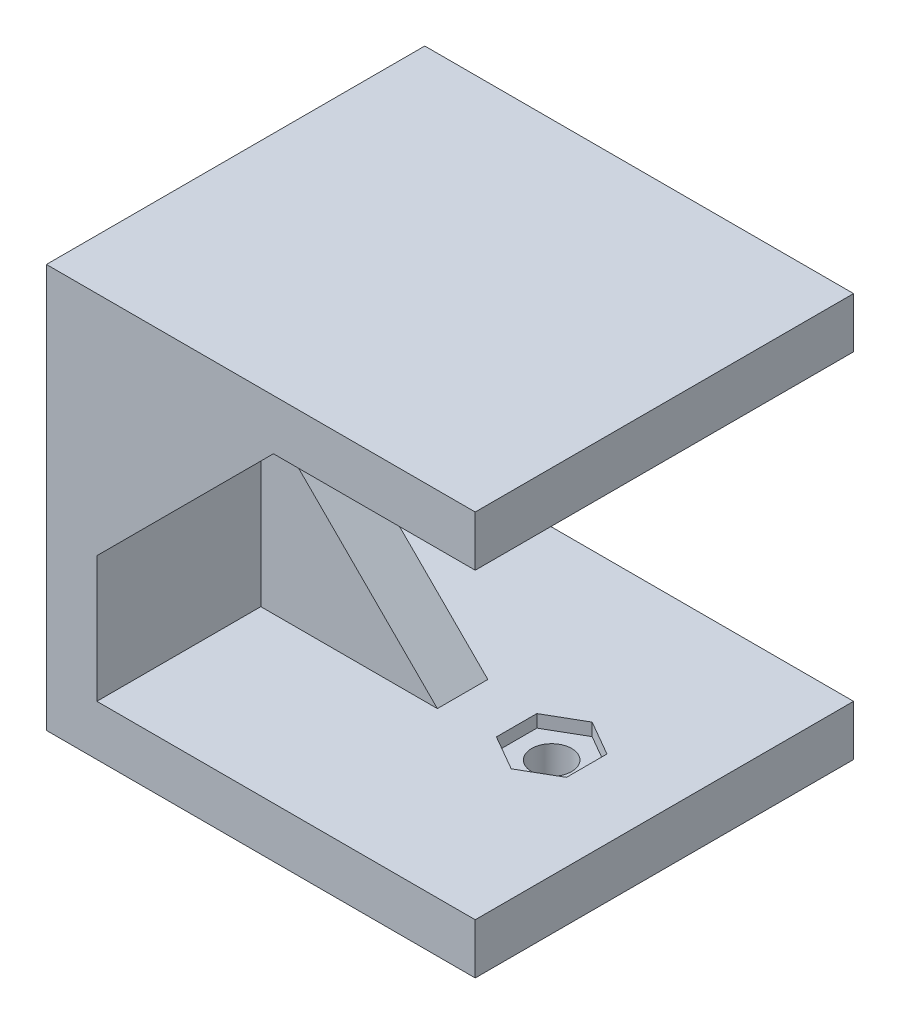
ISO-10303-21;
HEADER;
FILE_DESCRIPTION(('STEP AP214'),'2;1');
FILE_NAME('part.step','',(''),(''),'','','');
FILE_SCHEMA(('AUTOMOTIVE_DESIGN { 1 0 10303 214 1 1 1 1 }'));
ENDSEC;
DATA;
#1=APPLICATION_CONTEXT('core data for automotive mechanical design processes');
#2=APPLICATION_PROTOCOL_DEFINITION('international standard','automotive_design',2000,#1);
#3=PRODUCT_CONTEXT('',#1,'mechanical');
#4=PRODUCT('Part','Part','',(#3));
#5=PRODUCT_RELATED_PRODUCT_CATEGORY('part','',(#4));
#6=PRODUCT_DEFINITION_FORMATION('','',#4);
#7=PRODUCT_DEFINITION_CONTEXT('part definition',#1,'design');
#8=PRODUCT_DEFINITION('design','',#6,#7);
#9=PRODUCT_DEFINITION_SHAPE('','',#8);
#10=(LENGTH_UNIT() NAMED_UNIT(*) SI_UNIT(.MILLI.,.METRE.));
#11=(NAMED_UNIT(*) PLANE_ANGLE_UNIT() SI_UNIT($,.RADIAN.));
#12=(NAMED_UNIT(*) SI_UNIT($,.STERADIAN.) SOLID_ANGLE_UNIT());
#13=UNCERTAINTY_MEASURE_WITH_UNIT(LENGTH_MEASURE(1.E-05),#10,'distance_accuracy_value','');
#14=(GEOMETRIC_REPRESENTATION_CONTEXT(3) GLOBAL_UNCERTAINTY_ASSIGNED_CONTEXT((#13)) GLOBAL_UNIT_ASSIGNED_CONTEXT((#10,
#11,#12)) REPRESENTATION_CONTEXT('',''));
#15=CARTESIAN_POINT('',(0.,0.,0.));
#16=DIRECTION('',(0.,0.,1.));
#17=DIRECTION('',(1.,0.,0.));
#18=AXIS2_PLACEMENT_3D('',#15,#16,#17);
#19=CARTESIAN_POINT('',(50.125,0.,-30.));
#20=DIRECTION('',(0.,1.,0.));
#21=DIRECTION('',(0.,0.,1.));
#22=AXIS2_PLACEMENT_3D('',#19,#20,#21);
#23=CYLINDRICAL_SURFACE('',#22,3.175);
#24=CARTESIAN_POINT('',(50.125,0.,-30.));
#25=DIRECTION('',(0.,1.,0.));
#26=DIRECTION('',(0.,0.,1.));
#27=AXIS2_PLACEMENT_3D('',#24,#25,#26);
#28=CIRCLE('',#27,3.175);
#29=CARTESIAN_POINT('',(50.125,0.,-26.825));
#30=VERTEX_POINT('',#29);
#31=EDGE_CURVE('E298',#30,#30,#28,.T.);
#32=ORIENTED_EDGE('',*,*,#31,.F.);
#33=EDGE_LOOP('',(#32));
#34=FACE_BOUND('',#33,.T.);
#35=CARTESIAN_POINT('',(50.125,6.,-30.));
#36=DIRECTION('',(0.,1.,0.));
#37=DIRECTION('',(0.,0.,1.));
#38=AXIS2_PLACEMENT_3D('',#35,#36,#37);
#39=CIRCLE('',#38,3.175);
#40=CARTESIAN_POINT('',(50.125,6.,-26.825));
#41=VERTEX_POINT('',#40);
#42=EDGE_CURVE('E44',#41,#41,#39,.F.);
#43=ORIENTED_EDGE('',*,*,#42,.F.);
#44=EDGE_LOOP('',(#43));
#45=FACE_BOUND('',#44,.T.);
#46=ADVANCED_FACE('F40',(#34,#45),#23,.F.);
#47=CARTESIAN_POINT('',(8.,64.,0.));
#48=DIRECTION('',(-1.,0.,0.));
#49=DIRECTION('',(0.,0.,1.));
#50=AXIS2_PLACEMENT_3D('',#47,#48,#49);
#51=PLANE('',#50);
#52=DIRECTION('',(0.,-1.,0.));
#53=VECTOR('',#52,1.);
#54=CARTESIAN_POINT('',(8.,36.,-34.));
#55=LINE('',#54,#53);
#56=CARTESIAN_POINT('',(8.,36.,-34.));
#57=VERTEX_POINT('',#56);
#58=CARTESIAN_POINT('',(8.,8.,-34.));
#59=VERTEX_POINT('',#58);
#60=EDGE_CURVE('E248',#57,#59,#55,.T.);
#61=ORIENTED_EDGE('',*,*,#60,.T.);
#62=DIRECTION('',(0.,0.,-1.));
#63=VECTOR('',#62,1.);
#64=CARTESIAN_POINT('',(8.,8.,0.));
#65=LINE('',#64,#63);
#66=CARTESIAN_POINT('',(8.,8.,-60.));
#67=VERTEX_POINT('',#66);
#68=EDGE_CURVE('E310',#59,#67,#65,.T.);
#69=ORIENTED_EDGE('',*,*,#68,.T.);
#70=DIRECTION('',(0.,-1.,0.));
#71=VECTOR('',#70,1.);
#72=CARTESIAN_POINT('',(8.,64.,-60.));
#73=LINE('',#72,#71);
#74=CARTESIAN_POINT('',(8.,28.,-60.));
#75=VERTEX_POINT('',#74);
#76=EDGE_CURVE('E320',#75,#67,#73,.T.);
#77=ORIENTED_EDGE('',*,*,#76,.F.);
#78=DIRECTION('',(0.,0.,-1.));
#79=VECTOR('',#78,1.);
#80=CARTESIAN_POINT('',(8.,28.,-52.));
#81=LINE('',#80,#79);
#82=CARTESIAN_POINT('',(8.,28.,-52.));
#83=VERTEX_POINT('',#82);
#84=EDGE_CURVE('E268',#83,#75,#81,.T.);
#85=ORIENTED_EDGE('',*,*,#84,.F.);
#86=DIRECTION('',(0.,-1.,0.));
#87=VECTOR('',#86,1.);
#88=CARTESIAN_POINT('',(8.,56.,-52.));
#89=LINE('',#88,#87);
#90=CARTESIAN_POINT('',(8.,56.,-52.));
#91=VERTEX_POINT('',#90);
#92=EDGE_CURVE('E264',#91,#83,#89,.T.);
#93=ORIENTED_EDGE('',*,*,#92,.F.);
#94=DIRECTION('',(0.,0.,-1.));
#95=VECTOR('',#94,1.);
#96=CARTESIAN_POINT('',(8.,56.,0.));
#97=LINE('',#96,#95);
#98=CARTESIAN_POINT('',(8.,56.,-8.));
#99=VERTEX_POINT('',#98);
#100=EDGE_CURVE('E286',#99,#91,#97,.T.);
#101=ORIENTED_EDGE('',*,*,#100,.F.);
#102=DIRECTION('',(0.,-1.,0.));
#103=VECTOR('',#102,1.);
#104=CARTESIAN_POINT('',(8.,56.,-8.));
#105=LINE('',#104,#103);
#106=CARTESIAN_POINT('',(8.,28.,-8.));
#107=VERTEX_POINT('',#106);
#108=EDGE_CURVE('E275',#99,#107,#105,.T.);
#109=ORIENTED_EDGE('',*,*,#108,.T.);
#110=DIRECTION('',(0.,0.,1.));
#111=VECTOR('',#110,1.);
#112=CARTESIAN_POINT('',(8.,28.,-8.));
#113=LINE('',#112,#111);
#114=CARTESIAN_POINT('',(8.,28.,0.));
#115=VERTEX_POINT('',#114);
#116=EDGE_CURVE('E280',#107,#115,#113,.T.);
#117=ORIENTED_EDGE('',*,*,#116,.T.);
#118=DIRECTION('',(0.,-1.,0.));
#119=VECTOR('',#118,1.);
#120=CARTESIAN_POINT('',(8.,64.,0.));
#121=LINE('',#120,#119);
#122=CARTESIAN_POINT('',(8.,8.,0.));
#123=VERTEX_POINT('',#122);
#124=EDGE_CURVE('E325',#115,#123,#121,.T.);
#125=ORIENTED_EDGE('',*,*,#124,.T.);
#126=CARTESIAN_POINT('',(8.,8.,-26.));
#127=VERTEX_POINT('',#126);
#128=EDGE_CURVE('E314',#123,#127,#65,.T.);
#129=ORIENTED_EDGE('',*,*,#128,.T.);
#130=DIRECTION('',(0.,-1.,0.));
#131=VECTOR('',#130,1.);
#132=CARTESIAN_POINT('',(8.,36.,-26.));
#133=LINE('',#132,#131);
#134=CARTESIAN_POINT('',(8.,36.,-26.));
#135=VERTEX_POINT('',#134);
#136=EDGE_CURVE('E64',#135,#127,#133,.T.);
#137=ORIENTED_EDGE('',*,*,#136,.F.);
#138=DIRECTION('',(0.,0.,1.));
#139=VECTOR('',#138,1.);
#140=CARTESIAN_POINT('',(8.,36.,-34.));
#141=LINE('',#140,#139);
#142=EDGE_CURVE('E254',#57,#135,#141,.T.);
#143=ORIENTED_EDGE('',*,*,#142,.F.);
#144=EDGE_LOOP('',(#61,#69,#77,#85,#93,#101,#109,#117,#125,#129,#137,#143));
#145=FACE_BOUND('',#144,.T.);
#146=ADVANCED_FACE('F390',(#145),#51,.F.);
#147=CARTESIAN_POINT('',(0.,8.,0.));
#148=DIRECTION('',(0.,-1.,0.));
#149=DIRECTION('',(0.,0.,-1.));
#150=AXIS2_PLACEMENT_3D('',#147,#148,#149);
#151=PLANE('',#150);
#152=DIRECTION('',(-0.866025403784439,0.,0.5));
#153=VECTOR('',#152,1.);
#154=CARTESIAN_POINT('',(50.125,8.,-36.4158048663697));
#155=LINE('',#154,#153);
#156=CARTESIAN_POINT('',(50.125,8.,-36.4158048663697));
#157=VERTEX_POINT('',#156);
#158=CARTESIAN_POINT('',(44.56875,8.,-33.2079024331849));
#159=VERTEX_POINT('',#158);
#160=EDGE_CURVE('E221',#157,#159,#155,.T.);
#161=ORIENTED_EDGE('',*,*,#160,.F.);
#162=DIRECTION('',(-0.866025403784439,0.,-0.5));
#163=VECTOR('',#162,1.);
#164=CARTESIAN_POINT('',(55.68125,8.,-33.2079024331849));
#165=LINE('',#164,#163);
#166=CARTESIAN_POINT('',(55.68125,8.,-33.2079024331849));
#167=VERTEX_POINT('',#166);
#168=EDGE_CURVE('E56',#167,#157,#165,.T.);
#169=ORIENTED_EDGE('',*,*,#168,.F.);
#170=DIRECTION('',(0.,0.,-1.));
#171=VECTOR('',#170,1.);
#172=CARTESIAN_POINT('',(55.68125,8.,-26.7920975668151));
#173=LINE('',#172,#171);
#174=CARTESIAN_POINT('',(55.68125,8.,-26.7920975668151));
#175=VERTEX_POINT('',#174);
#176=EDGE_CURVE('E207',#175,#167,#173,.T.);
#177=ORIENTED_EDGE('',*,*,#176,.F.);
#178=DIRECTION('',(0.866025403784439,0.,-0.5));
#179=VECTOR('',#178,1.);
#180=CARTESIAN_POINT('',(50.125,8.,-23.5841951336303));
#181=LINE('',#180,#179);
#182=CARTESIAN_POINT('',(50.125,8.,-23.5841951336303));
#183=VERTEX_POINT('',#182);
#184=EDGE_CURVE('E210',#183,#175,#181,.T.);
#185=ORIENTED_EDGE('',*,*,#184,.F.);
#186=DIRECTION('',(0.866025403784439,0.,0.5));
#187=VECTOR('',#186,1.);
#188=CARTESIAN_POINT('',(44.56875,8.,-26.7920975668151));
#189=LINE('',#188,#187);
#190=CARTESIAN_POINT('',(44.56875,8.,-26.7920975668151));
#191=VERTEX_POINT('',#190);
#192=EDGE_CURVE('E226',#191,#183,#189,.T.);
#193=ORIENTED_EDGE('',*,*,#192,.F.);
#194=DIRECTION('',(0.,0.,1.));
#195=VECTOR('',#194,1.);
#196=CARTESIAN_POINT('',(44.56875,8.,-33.2079024331849));
#197=LINE('',#196,#195);
#198=EDGE_CURVE('E223',#159,#191,#197,.T.);
#199=ORIENTED_EDGE('',*,*,#198,.F.);
#200=EDGE_LOOP('',(#161,#169,#177,#185,#193,#199));
#201=FACE_BOUND('',#200,.T.);
#202=DIRECTION('',(1.,0.,0.));
#203=VECTOR('',#202,1.);
#204=CARTESIAN_POINT('',(8.,8.,-34.));
#205=LINE('',#204,#203);
#206=CARTESIAN_POINT('',(36.0000000000001,8.,-34.));
#207=VERTEX_POINT('',#206);
#208=EDGE_CURVE('E251',#59,#207,#205,.T.);
#209=ORIENTED_EDGE('',*,*,#208,.T.);
#210=DIRECTION('',(0.,0.,1.));
#211=VECTOR('',#210,1.);
#212=CARTESIAN_POINT('',(36.0000000000001,8.,-34.));
#213=LINE('',#212,#211);
#214=CARTESIAN_POINT('',(36.0000000000001,8.,-26.));
#215=VERTEX_POINT('',#214);
#216=EDGE_CURVE('E255',#207,#215,#213,.T.);
#217=ORIENTED_EDGE('',*,*,#216,.T.);
#218=DIRECTION('',(1.,0.,0.));
#219=VECTOR('',#218,1.);
#220=CARTESIAN_POINT('',(8.,8.,-26.));
#221=LINE('',#220,#219);
#222=EDGE_CURVE('E243',#127,#215,#221,.T.);
#223=ORIENTED_EDGE('',*,*,#222,.F.);
#224=ORIENTED_EDGE('',*,*,#128,.F.);
#225=DIRECTION('',(1.,0.,0.));
#226=VECTOR('',#225,1.);
#227=CARTESIAN_POINT('',(0.,8.,0.));
#228=LINE('',#227,#226);
#229=CARTESIAN_POINT('',(68.,8.,0.));
#230=VERTEX_POINT('',#229);
#231=EDGE_CURVE('E328',#123,#230,#228,.T.);
#232=ORIENTED_EDGE('',*,*,#231,.T.);
#233=DIRECTION('',(0.,0.,-1.));
#234=VECTOR('',#233,1.);
#235=CARTESIAN_POINT('',(68.,8.,0.));
#236=LINE('',#235,#234);
#237=CARTESIAN_POINT('',(68.,8.,-60.));
#238=VERTEX_POINT('',#237);
#239=EDGE_CURVE('E330',#230,#238,#236,.T.);
#240=ORIENTED_EDGE('',*,*,#239,.T.);
#241=DIRECTION('',(-1.,0.,0.));
#242=VECTOR('',#241,1.);
#243=CARTESIAN_POINT('',(0.,8.,-60.));
#244=LINE('',#243,#242);
#245=EDGE_CURVE('E333',#238,#67,#244,.T.);
#246=ORIENTED_EDGE('',*,*,#245,.T.);
#247=ORIENTED_EDGE('',*,*,#68,.F.);
#248=EDGE_LOOP('',(#209,#217,#223,#224,#232,#240,#246,#247));
#249=FACE_BOUND('',#248,.T.);
#250=ADVANCED_FACE('F394',(#201,#249),#151,.F.);
#251=CARTESIAN_POINT('',(128.530983801686,56.,0.));
#252=DIRECTION('',(0.,1.,0.));
#253=DIRECTION('',(0.,0.,1.));
#254=AXIS2_PLACEMENT_3D('',#251,#252,#253);
#255=PLANE('',#254);
#256=DIRECTION('',(0.,0.,-1.));
#257=VECTOR('',#256,1.);
#258=CARTESIAN_POINT('',(35.9999999999997,56.,-52.));
#259=LINE('',#258,#257);
#260=CARTESIAN_POINT('',(35.9999999999997,56.,-52.));
#261=VERTEX_POINT('',#260);
#262=CARTESIAN_POINT('',(35.9999999999997,56.,-60.));
#263=VERTEX_POINT('',#262);
#264=EDGE_CURVE('E266',#261,#263,#259,.T.);
#265=ORIENTED_EDGE('',*,*,#264,.T.);
#266=DIRECTION('',(-1.,0.,0.));
#267=VECTOR('',#266,1.);
#268=CARTESIAN_POINT('',(128.530983801686,56.,-60.));
#269=LINE('',#268,#267);
#270=CARTESIAN_POINT('',(68.,56.,-60.));
#271=VERTEX_POINT('',#270);
#272=EDGE_CURVE('E301',#271,#263,#269,.T.);
#273=ORIENTED_EDGE('',*,*,#272,.F.);
#274=DIRECTION('',(0.,0.,1.));
#275=VECTOR('',#274,1.);
#276=CARTESIAN_POINT('',(68.,56.,0.));
#277=LINE('',#276,#275);
#278=CARTESIAN_POINT('',(68.,56.,0.));
#279=VERTEX_POINT('',#278);
#280=EDGE_CURVE('E291',#271,#279,#277,.T.);
#281=ORIENTED_EDGE('',*,*,#280,.T.);
#282=DIRECTION('',(-1.,0.,0.));
#283=VECTOR('',#282,1.);
#284=CARTESIAN_POINT('',(128.530983801686,56.,0.));
#285=LINE('',#284,#283);
#286=CARTESIAN_POINT('',(35.9999999999997,56.,0.));
#287=VERTEX_POINT('',#286);
#288=EDGE_CURVE('E304',#279,#287,#285,.T.);
#289=ORIENTED_EDGE('',*,*,#288,.T.);
#290=DIRECTION('',(0.,0.,1.));
#291=VECTOR('',#290,1.);
#292=CARTESIAN_POINT('',(35.9999999999997,56.,-8.));
#293=LINE('',#292,#291);
#294=CARTESIAN_POINT('',(35.9999999999997,56.,-8.));
#295=VERTEX_POINT('',#294);
#296=EDGE_CURVE('E283',#295,#287,#293,.T.);
#297=ORIENTED_EDGE('',*,*,#296,.F.);
#298=DIRECTION('',(-1.,0.,0.));
#299=VECTOR('',#298,1.);
#300=CARTESIAN_POINT('',(8.,56.,-8.));
#301=LINE('',#300,#299);
#302=EDGE_CURVE('E273',#295,#99,#301,.T.);
#303=ORIENTED_EDGE('',*,*,#302,.T.);
#304=ORIENTED_EDGE('',*,*,#100,.T.);
#305=DIRECTION('',(-1.,0.,0.));
#306=VECTOR('',#305,1.);
#307=CARTESIAN_POINT('',(8.,56.,-52.));
#308=LINE('',#307,#306);
#309=EDGE_CURVE('E260',#261,#91,#308,.T.);
#310=ORIENTED_EDGE('',*,*,#309,.F.);
#311=EDGE_LOOP('',(#265,#273,#281,#289,#297,#303,#304,#310));
#312=FACE_BOUND('',#311,.T.);
#313=ADVANCED_FACE('F381',(#312),#255,.F.);
#314=CARTESIAN_POINT('',(0.,8.,0.));
#315=DIRECTION('',(1.,0.,0.));
#316=DIRECTION('',(0.,0.,-1.));
#317=AXIS2_PLACEMENT_3D('',#314,#315,#316);
#318=PLANE('',#317);
#319=DIRECTION('',(0.,0.,1.));
#320=VECTOR('',#319,1.);
#321=CARTESIAN_POINT('',(0.,0.,0.));
#322=LINE('',#321,#320);
#323=CARTESIAN_POINT('',(0.,0.,-60.));
#324=VERTEX_POINT('',#323);
#325=CARTESIAN_POINT('',(0.,0.,0.));
#326=VERTEX_POINT('',#325);
#327=EDGE_CURVE('E327',#324,#326,#322,.T.);
#328=ORIENTED_EDGE('',*,*,#327,.T.);
#329=DIRECTION('',(0.,-1.,0.));
#330=VECTOR('',#329,1.);
#331=CARTESIAN_POINT('',(0.,8.,0.));
#332=LINE('',#331,#330);
#333=CARTESIAN_POINT('',(0.,64.,0.));
#334=VERTEX_POINT('',#333);
#335=EDGE_CURVE('E11',#334,#326,#332,.T.);
#336=ORIENTED_EDGE('',*,*,#335,.F.);
#337=DIRECTION('',(0.,0.,1.));
#338=VECTOR('',#337,1.);
#339=CARTESIAN_POINT('',(0.,64.,-60.));
#340=LINE('',#339,#338);
#341=CARTESIAN_POINT('',(0.,64.,-60.));
#342=VERTEX_POINT('',#341);
#343=EDGE_CURVE('E317',#342,#334,#340,.T.);
#344=ORIENTED_EDGE('',*,*,#343,.F.);
#345=DIRECTION('',(0.,-1.,0.));
#346=VECTOR('',#345,1.);
#347=CARTESIAN_POINT('',(0.,8.,-60.));
#348=LINE('',#347,#346);
#349=EDGE_CURVE('E336',#342,#324,#348,.T.);
#350=ORIENTED_EDGE('',*,*,#349,.T.);
#351=EDGE_LOOP('',(#328,#336,#344,#350));
#352=FACE_BOUND('',#351,.T.);
#353=ADVANCED_FACE('F42',(#352),#318,.F.);
#354=CARTESIAN_POINT('',(0.,8.,0.));
#355=DIRECTION('',(0.,0.,-1.));
#356=DIRECTION('',(-1.,0.,0.));
#357=AXIS2_PLACEMENT_3D('',#354,#355,#356);
#358=PLANE('',#357);
#359=ORIENTED_EDGE('',*,*,#124,.F.);
#360=DIRECTION('',(0.707106781186544,0.707106781186551,0.));
#361=VECTOR('',#360,1.);
#362=CARTESIAN_POINT('',(8.,28.,0.));
#363=LINE('',#362,#361);
#364=EDGE_CURVE('E270',#115,#287,#363,.T.);
#365=ORIENTED_EDGE('',*,*,#364,.T.);
#366=ORIENTED_EDGE('',*,*,#288,.F.);
#367=DIRECTION('',(0.,1.,0.));
#368=VECTOR('',#367,1.);
#369=CARTESIAN_POINT('',(68.,56.,0.));
#370=LINE('',#369,#368);
#371=CARTESIAN_POINT('',(68.,64.,0.));
#372=VERTEX_POINT('',#371);
#373=EDGE_CURVE('E295',#279,#372,#370,.T.);
#374=ORIENTED_EDGE('',*,*,#373,.T.);
#375=DIRECTION('',(1.,0.,0.));
#376=VECTOR('',#375,1.);
#377=CARTESIAN_POINT('',(0.,64.,0.));
#378=LINE('',#377,#376);
#379=EDGE_CURVE('E311',#334,#372,#378,.T.);
#380=ORIENTED_EDGE('',*,*,#379,.F.);
#381=ORIENTED_EDGE('',*,*,#335,.T.);
#382=DIRECTION('',(1.,0.,0.));
#383=VECTOR('',#382,1.);
#384=CARTESIAN_POINT('',(0.,0.,0.));
#385=LINE('',#384,#383);
#386=CARTESIAN_POINT('',(68.,0.,0.));
#387=VERTEX_POINT('',#386);
#388=EDGE_CURVE('E339',#326,#387,#385,.T.);
#389=ORIENTED_EDGE('',*,*,#388,.T.);
#390=DIRECTION('',(0.,-1.,0.));
#391=VECTOR('',#390,1.);
#392=CARTESIAN_POINT('',(68.,8.,0.));
#393=LINE('',#392,#391);
#394=EDGE_CURVE('E49',#230,#387,#393,.T.);
#395=ORIENTED_EDGE('',*,*,#394,.F.);
#396=ORIENTED_EDGE('',*,*,#231,.F.);
#397=EDGE_LOOP('',(#359,#365,#366,#374,#380,#381,#389,#395,#396));
#398=FACE_BOUND('',#397,.T.);
#399=ADVANCED_FACE('F373',(#398),#358,.F.);
#400=CARTESIAN_POINT('',(68.,8.,0.));
#401=DIRECTION('',(-1.,0.,0.));
#402=DIRECTION('',(0.,0.,1.));
#403=AXIS2_PLACEMENT_3D('',#400,#401,#402);
#404=PLANE('',#403);
#405=DIRECTION('',(0.,0.,-1.));
#406=VECTOR('',#405,1.);
#407=CARTESIAN_POINT('',(68.,0.,0.));
#408=LINE('',#407,#406);
#409=CARTESIAN_POINT('',(68.,0.,-60.));
#410=VERTEX_POINT('',#409);
#411=EDGE_CURVE('E341',#387,#410,#408,.T.);
#412=ORIENTED_EDGE('',*,*,#411,.T.);
#413=DIRECTION('',(0.,-1.,0.));
#414=VECTOR('',#413,1.);
#415=CARTESIAN_POINT('',(68.,8.,-60.));
#416=LINE('',#415,#414);
#417=EDGE_CURVE('E346',#238,#410,#416,.T.);
#418=ORIENTED_EDGE('',*,*,#417,.F.);
#419=ORIENTED_EDGE('',*,*,#239,.F.);
#420=ORIENTED_EDGE('',*,*,#394,.T.);
#421=EDGE_LOOP('',(#412,#418,#419,#420));
#422=FACE_BOUND('',#421,.T.);
#423=ADVANCED_FACE('F354',(#422),#404,.F.);
#424=CARTESIAN_POINT('',(0.,8.,-60.));
#425=DIRECTION('',(0.,0.,1.));
#426=DIRECTION('',(1.,0.,0.));
#427=AXIS2_PLACEMENT_3D('',#424,#425,#426);
#428=PLANE('',#427);
#429=DIRECTION('',(0.707106781186544,0.707106781186551,0.));
#430=VECTOR('',#429,1.);
#431=CARTESIAN_POINT('',(8.,28.,-60.));
#432=LINE('',#431,#430);
#433=EDGE_CURVE('E258',#75,#263,#432,.T.);
#434=ORIENTED_EDGE('',*,*,#433,.F.);
#435=ORIENTED_EDGE('',*,*,#76,.T.);
#436=ORIENTED_EDGE('',*,*,#245,.F.);
#437=ORIENTED_EDGE('',*,*,#417,.T.);
#438=DIRECTION('',(-1.,0.,0.));
#439=VECTOR('',#438,1.);
#440=CARTESIAN_POINT('',(0.,0.,-60.));
#441=LINE('',#440,#439);
#442=EDGE_CURVE('E331',#410,#324,#441,.T.);
#443=ORIENTED_EDGE('',*,*,#442,.T.);
#444=ORIENTED_EDGE('',*,*,#349,.F.);
#445=DIRECTION('',(-1.,0.,0.));
#446=VECTOR('',#445,1.);
#447=CARTESIAN_POINT('',(8.,64.,-60.));
#448=LINE('',#447,#446);
#449=CARTESIAN_POINT('',(68.,64.,-60.));
#450=VERTEX_POINT('',#449);
#451=EDGE_CURVE('E313',#450,#342,#448,.T.);
#452=ORIENTED_EDGE('',*,*,#451,.F.);
#453=DIRECTION('',(0.,-1.,0.));
#454=VECTOR('',#453,1.);
#455=CARTESIAN_POINT('',(68.,64.,-60.));
#456=LINE('',#455,#454);
#457=EDGE_CURVE('E288',#450,#271,#456,.T.);
#458=ORIENTED_EDGE('',*,*,#457,.T.);
#459=ORIENTED_EDGE('',*,*,#272,.T.);
#460=EDGE_LOOP('',(#434,#435,#436,#437,#443,#444,#452,#458,#459));
#461=FACE_BOUND('',#460,.T.);
#462=ADVANCED_FACE('F364',(#461),#428,.F.);
#463=CARTESIAN_POINT('',(0.,0.,0.));
#464=DIRECTION('',(0.,-1.,0.));
#465=DIRECTION('',(0.,0.,-1.));
#466=AXIS2_PLACEMENT_3D('',#463,#464,#465);
#467=PLANE('',#466);
#468=ORIENTED_EDGE('',*,*,#31,.T.);
#469=EDGE_LOOP('',(#468));
#470=FACE_BOUND('',#469,.T.);
#471=ORIENTED_EDGE('',*,*,#327,.F.);
#472=ORIENTED_EDGE('',*,*,#442,.F.);
#473=ORIENTED_EDGE('',*,*,#411,.F.);
#474=ORIENTED_EDGE('',*,*,#388,.F.);
#475=EDGE_LOOP('',(#471,#472,#473,#474));
#476=FACE_BOUND('',#475,.T.);
#477=ADVANCED_FACE('F361',(#470,#476),#467,.T.);
#478=CARTESIAN_POINT('',(0.,64.,0.));
#479=DIRECTION('',(0.,1.,0.));
#480=DIRECTION('',(0.,0.,1.));
#481=AXIS2_PLACEMENT_3D('',#478,#479,#480);
#482=PLANE('',#481);
#483=ORIENTED_EDGE('',*,*,#379,.T.);
#484=DIRECTION('',(0.,0.,-1.));
#485=VECTOR('',#484,1.);
#486=CARTESIAN_POINT('',(68.,64.,0.));
#487=LINE('',#486,#485);
#488=EDGE_CURVE('E292',#372,#450,#487,.T.);
#489=ORIENTED_EDGE('',*,*,#488,.T.);
#490=ORIENTED_EDGE('',*,*,#451,.T.);
#491=ORIENTED_EDGE('',*,*,#343,.T.);
#492=EDGE_LOOP('',(#483,#489,#490,#491));
#493=FACE_BOUND('',#492,.T.);
#494=ADVANCED_FACE('F370',(#493),#482,.T.);
#495=CARTESIAN_POINT('',(68.,8.,0.));
#496=DIRECTION('',(-1.,0.,0.));
#497=DIRECTION('',(0.,0.,1.));
#498=AXIS2_PLACEMENT_3D('',#495,#496,#497);
#499=PLANE('',#498);
#500=ORIENTED_EDGE('',*,*,#280,.F.);
#501=ORIENTED_EDGE('',*,*,#457,.F.);
#502=ORIENTED_EDGE('',*,*,#488,.F.);
#503=ORIENTED_EDGE('',*,*,#373,.F.);
#504=EDGE_LOOP('',(#500,#501,#502,#503));
#505=FACE_BOUND('',#504,.T.);
#506=ADVANCED_FACE('F376',(#505),#499,.F.);
#507=CARTESIAN_POINT('',(8.,28.,-8.));
#508=DIRECTION('',(0.707106781186551,-0.707106781186544,0.));
#509=DIRECTION('',(0.707106781186544,0.707106781186551,0.));
#510=AXIS2_PLACEMENT_3D('',#507,#508,#509);
#511=PLANE('',#510);
#512=ORIENTED_EDGE('',*,*,#364,.F.);
#513=ORIENTED_EDGE('',*,*,#116,.F.);
#514=DIRECTION('',(0.707106781186544,0.707106781186551,0.));
#515=VECTOR('',#514,1.);
#516=CARTESIAN_POINT('',(8.,28.,-8.));
#517=LINE('',#516,#515);
#518=EDGE_CURVE('E277',#107,#295,#517,.T.);
#519=ORIENTED_EDGE('',*,*,#518,.T.);
#520=ORIENTED_EDGE('',*,*,#296,.T.);
#521=EDGE_LOOP('',(#512,#513,#519,#520));
#522=FACE_BOUND('',#521,.T.);
#523=ADVANCED_FACE('F399',(#522),#511,.T.);
#524=CARTESIAN_POINT('',(0.,0.,-8.));
#525=DIRECTION('',(0.,0.,-1.));
#526=DIRECTION('',(-1.,0.,0.));
#527=AXIS2_PLACEMENT_3D('',#524,#525,#526);
#528=PLANE('',#527);
#529=ORIENTED_EDGE('',*,*,#302,.F.);
#530=ORIENTED_EDGE('',*,*,#518,.F.);
#531=ORIENTED_EDGE('',*,*,#108,.F.);
#532=EDGE_LOOP('',(#529,#530,#531));
#533=FACE_BOUND('',#532,.T.);
#534=ADVANCED_FACE('F404',(#533),#528,.T.);
#535=CARTESIAN_POINT('',(8.,28.,-52.));
#536=DIRECTION('',(-0.707106781186551,0.707106781186544,0.));
#537=DIRECTION('',(-0.707106781186544,-0.707106781186551,0.));
#538=AXIS2_PLACEMENT_3D('',#535,#536,#537);
#539=PLANE('',#538);
#540=ORIENTED_EDGE('',*,*,#433,.T.);
#541=ORIENTED_EDGE('',*,*,#264,.F.);
#542=DIRECTION('',(0.707106781186544,0.707106781186551,0.));
#543=VECTOR('',#542,1.);
#544=CARTESIAN_POINT('',(8.,28.,-52.));
#545=LINE('',#544,#543);
#546=EDGE_CURVE('E262',#83,#261,#545,.T.);
#547=ORIENTED_EDGE('',*,*,#546,.F.);
#548=ORIENTED_EDGE('',*,*,#84,.T.);
#549=EDGE_LOOP('',(#540,#541,#547,#548));
#550=FACE_BOUND('',#549,.T.);
#551=ADVANCED_FACE('F386',(#550),#539,.F.);
#552=CARTESIAN_POINT('',(0.,0.,-52.));
#553=DIRECTION('',(0.,0.,1.));
#554=DIRECTION('',(-1.,0.,0.));
#555=AXIS2_PLACEMENT_3D('',#552,#553,#554);
#556=PLANE('',#555);
#557=ORIENTED_EDGE('',*,*,#309,.T.);
#558=ORIENTED_EDGE('',*,*,#92,.T.);
#559=ORIENTED_EDGE('',*,*,#546,.T.);
#560=EDGE_LOOP('',(#557,#558,#559));
#561=FACE_BOUND('',#560,.T.);
#562=ADVANCED_FACE('F411',(#561),#556,.T.);
#563=CARTESIAN_POINT('',(8.,36.,-34.));
#564=DIRECTION('',(0.707106781186546,0.707106781186549,0.));
#565=DIRECTION('',(-0.707106781186549,0.707106781186546,0.));
#566=AXIS2_PLACEMENT_3D('',#563,#564,#565);
#567=PLANE('',#566);
#568=ORIENTED_EDGE('',*,*,#142,.T.);
#569=DIRECTION('',(-0.707106781186549,0.707106781186546,0.));
#570=VECTOR('',#569,1.);
#571=CARTESIAN_POINT('',(8.,36.,-26.));
#572=LINE('',#571,#570);
#573=EDGE_CURVE('E240',#215,#135,#572,.T.);
#574=ORIENTED_EDGE('',*,*,#573,.F.);
#575=ORIENTED_EDGE('',*,*,#216,.F.);
#576=DIRECTION('',(-0.707106781186549,0.707106781186546,0.));
#577=VECTOR('',#576,1.);
#578=CARTESIAN_POINT('',(8.,36.,-34.));
#579=LINE('',#578,#577);
#580=EDGE_CURVE('E245',#207,#57,#579,.T.);
#581=ORIENTED_EDGE('',*,*,#580,.T.);
#582=EDGE_LOOP('',(#568,#574,#575,#581));
#583=FACE_BOUND('',#582,.T.);
#584=ADVANCED_FACE('F467',(#583),#567,.T.);
#585=CARTESIAN_POINT('',(0.,0.,-34.));
#586=DIRECTION('',(0.,0.,1.));
#587=DIRECTION('',(1.,0.,0.));
#588=AXIS2_PLACEMENT_3D('',#585,#586,#587);
#589=PLANE('',#588);
#590=ORIENTED_EDGE('',*,*,#580,.F.);
#591=ORIENTED_EDGE('',*,*,#208,.F.);
#592=ORIENTED_EDGE('',*,*,#60,.F.);
#593=EDGE_LOOP('',(#590,#591,#592));
#594=FACE_BOUND('',#593,.T.);
#595=ADVANCED_FACE('F471',(#594),#589,.F.);
#596=CARTESIAN_POINT('',(0.,0.,-26.));
#597=DIRECTION('',(0.,0.,1.));
#598=DIRECTION('',(1.,0.,0.));
#599=AXIS2_PLACEMENT_3D('',#596,#597,#598);
#600=PLANE('',#599);
#601=ORIENTED_EDGE('',*,*,#573,.T.);
#602=ORIENTED_EDGE('',*,*,#136,.T.);
#603=ORIENTED_EDGE('',*,*,#222,.T.);
#604=EDGE_LOOP('',(#601,#602,#603));
#605=FACE_BOUND('',#604,.T.);
#606=ADVANCED_FACE('F481',(#605),#600,.T.);
#607=CARTESIAN_POINT('',(0.,6.,0.));
#608=DIRECTION('',(0.,1.,0.));
#609=DIRECTION('',(0.,0.,1.));
#610=AXIS2_PLACEMENT_3D('',#607,#608,#609);
#611=PLANE('',#610);
#612=DIRECTION('',(-0.866025403784439,0.,-0.5));
#613=VECTOR('',#612,1.);
#614=CARTESIAN_POINT('',(55.68125,6.,-33.2079024331849));
#615=LINE('',#614,#613);
#616=CARTESIAN_POINT('',(55.68125,6.,-33.2079024331849));
#617=VERTEX_POINT('',#616);
#618=CARTESIAN_POINT('',(50.125,6.,-36.4158048663697));
#619=VERTEX_POINT('',#618);
#620=EDGE_CURVE('E187',#617,#619,#615,.T.);
#621=ORIENTED_EDGE('',*,*,#620,.T.);
#622=DIRECTION('',(-0.866025403784439,0.,0.5));
#623=VECTOR('',#622,1.);
#624=CARTESIAN_POINT('',(50.125,6.,-36.4158048663697));
#625=LINE('',#624,#623);
#626=CARTESIAN_POINT('',(44.56875,6.,-33.2079024331849));
#627=VERTEX_POINT('',#626);
#628=EDGE_CURVE('E196',#619,#627,#625,.T.);
#629=ORIENTED_EDGE('',*,*,#628,.T.);
#630=DIRECTION('',(0.,0.,1.));
#631=VECTOR('',#630,1.);
#632=CARTESIAN_POINT('',(44.56875,6.,-33.2079024331849));
#633=LINE('',#632,#631);
#634=CARTESIAN_POINT('',(44.56875,6.,-26.7920975668151));
#635=VERTEX_POINT('',#634);
#636=EDGE_CURVE('E201',#627,#635,#633,.T.);
#637=ORIENTED_EDGE('',*,*,#636,.T.);
#638=DIRECTION('',(0.866025403784439,0.,0.5));
#639=VECTOR('',#638,1.);
#640=CARTESIAN_POINT('',(44.56875,6.,-26.7920975668151));
#641=LINE('',#640,#639);
#642=CARTESIAN_POINT('',(50.125,6.,-23.5841951336303));
#643=VERTEX_POINT('',#642);
#644=EDGE_CURVE('E214',#635,#643,#641,.T.);
#645=ORIENTED_EDGE('',*,*,#644,.T.);
#646=DIRECTION('',(0.866025403784439,0.,-0.5));
#647=VECTOR('',#646,1.);
#648=CARTESIAN_POINT('',(50.125,6.,-23.5841951336303));
#649=LINE('',#648,#647);
#650=CARTESIAN_POINT('',(55.68125,6.,-26.7920975668151));
#651=VERTEX_POINT('',#650);
#652=EDGE_CURVE('E217',#643,#651,#649,.T.);
#653=ORIENTED_EDGE('',*,*,#652,.T.);
#654=DIRECTION('',(0.,0.,-1.));
#655=VECTOR('',#654,1.);
#656=CARTESIAN_POINT('',(55.68125,6.,-26.7920975668151));
#657=LINE('',#656,#655);
#658=EDGE_CURVE('E193',#651,#617,#657,.T.);
#659=ORIENTED_EDGE('',*,*,#658,.T.);
#660=EDGE_LOOP('',(#621,#629,#637,#645,#653,#659));
#661=FACE_BOUND('',#660,.T.);
#662=ORIENTED_EDGE('',*,*,#42,.T.);
#663=EDGE_LOOP('',(#662));
#664=FACE_BOUND('',#663,.T.);
#665=ADVANCED_FACE('F203',(#661,#664),#611,.T.);
#666=CARTESIAN_POINT('',(55.68125,6.,-33.2079024331849));
#667=DIRECTION('',(0.5,0.,-0.866025403784439));
#668=DIRECTION('',(-0.866025403784439,0.,-0.5));
#669=AXIS2_PLACEMENT_3D('',#666,#667,#668);
#670=PLANE('',#669);
#671=ORIENTED_EDGE('',*,*,#168,.T.);
#672=DIRECTION('',(0.,1.,0.));
#673=VECTOR('',#672,1.);
#674=CARTESIAN_POINT('',(50.125,6.,-36.4158048663697));
#675=LINE('',#674,#673);
#676=EDGE_CURVE('E183',#619,#157,#675,.T.);
#677=ORIENTED_EDGE('',*,*,#676,.F.);
#678=ORIENTED_EDGE('',*,*,#620,.F.);
#679=DIRECTION('',(0.,1.,0.));
#680=VECTOR('',#679,1.);
#681=CARTESIAN_POINT('',(55.68125,6.,-33.2079024331849));
#682=LINE('',#681,#680);
#683=EDGE_CURVE('E231',#617,#167,#682,.T.);
#684=ORIENTED_EDGE('',*,*,#683,.T.);
#685=EDGE_LOOP('',(#671,#677,#678,#684));
#686=FACE_BOUND('',#685,.T.);
#687=ADVANCED_FACE('F185',(#686),#670,.F.);
#688=CARTESIAN_POINT('',(55.68125,6.,-26.7920975668151));
#689=DIRECTION('',(1.,0.,0.));
#690=DIRECTION('',(0.,0.,-1.));
#691=AXIS2_PLACEMENT_3D('',#688,#689,#690);
#692=PLANE('',#691);
#693=ORIENTED_EDGE('',*,*,#176,.T.);
#694=ORIENTED_EDGE('',*,*,#683,.F.);
#695=ORIENTED_EDGE('',*,*,#658,.F.);
#696=DIRECTION('',(0.,1.,0.));
#697=VECTOR('',#696,1.);
#698=CARTESIAN_POINT('',(55.68125,6.,-26.7920975668151));
#699=LINE('',#698,#697);
#700=EDGE_CURVE('E233',#651,#175,#699,.T.);
#701=ORIENTED_EDGE('',*,*,#700,.T.);
#702=EDGE_LOOP('',(#693,#694,#695,#701));
#703=FACE_BOUND('',#702,.T.);
#704=ADVANCED_FACE('F510',(#703),#692,.F.);
#705=CARTESIAN_POINT('',(50.125,6.,-23.5841951336303));
#706=DIRECTION('',(0.5,0.,0.866025403784439));
#707=DIRECTION('',(0.866025403784439,0.,-0.5));
#708=AXIS2_PLACEMENT_3D('',#705,#706,#707);
#709=PLANE('',#708);
#710=ORIENTED_EDGE('',*,*,#184,.T.);
#711=ORIENTED_EDGE('',*,*,#700,.F.);
#712=ORIENTED_EDGE('',*,*,#652,.F.);
#713=DIRECTION('',(0.,1.,0.));
#714=VECTOR('',#713,1.);
#715=CARTESIAN_POINT('',(50.125,6.,-23.5841951336303));
#716=LINE('',#715,#714);
#717=EDGE_CURVE('E235',#643,#183,#716,.T.);
#718=ORIENTED_EDGE('',*,*,#717,.T.);
#719=EDGE_LOOP('',(#710,#711,#712,#718));
#720=FACE_BOUND('',#719,.T.);
#721=ADVANCED_FACE('F518',(#720),#709,.F.);
#722=CARTESIAN_POINT('',(44.56875,6.,-26.7920975668151));
#723=DIRECTION('',(-0.5,0.,0.866025403784439));
#724=DIRECTION('',(0.866025403784439,0.,0.5));
#725=AXIS2_PLACEMENT_3D('',#722,#723,#724);
#726=PLANE('',#725);
#727=ORIENTED_EDGE('',*,*,#192,.T.);
#728=ORIENTED_EDGE('',*,*,#717,.F.);
#729=ORIENTED_EDGE('',*,*,#644,.F.);
#730=DIRECTION('',(0.,1.,0.));
#731=VECTOR('',#730,1.);
#732=CARTESIAN_POINT('',(44.56875,6.,-26.7920975668151));
#733=LINE('',#732,#731);
#734=EDGE_CURVE('E237',#635,#191,#733,.T.);
#735=ORIENTED_EDGE('',*,*,#734,.T.);
#736=EDGE_LOOP('',(#727,#728,#729,#735));
#737=FACE_BOUND('',#736,.T.);
#738=ADVANCED_FACE('F527',(#737),#726,.F.);
#739=CARTESIAN_POINT('',(44.56875,6.,-33.2079024331849));
#740=DIRECTION('',(-1.,0.,0.));
#741=DIRECTION('',(0.,0.,1.));
#742=AXIS2_PLACEMENT_3D('',#739,#740,#741);
#743=PLANE('',#742);
#744=ORIENTED_EDGE('',*,*,#198,.T.);
#745=ORIENTED_EDGE('',*,*,#734,.F.);
#746=ORIENTED_EDGE('',*,*,#636,.F.);
#747=DIRECTION('',(0.,1.,0.));
#748=VECTOR('',#747,1.);
#749=CARTESIAN_POINT('',(44.56875,6.,-33.2079024331849));
#750=LINE('',#749,#748);
#751=EDGE_CURVE('E192',#627,#159,#750,.T.);
#752=ORIENTED_EDGE('',*,*,#751,.T.);
#753=EDGE_LOOP('',(#744,#745,#746,#752));
#754=FACE_BOUND('',#753,.T.);
#755=ADVANCED_FACE('F536',(#754),#743,.F.);
#756=CARTESIAN_POINT('',(50.125,6.,-36.4158048663697));
#757=DIRECTION('',(-0.5,0.,-0.866025403784439));
#758=DIRECTION('',(-0.866025403784439,0.,0.5));
#759=AXIS2_PLACEMENT_3D('',#756,#757,#758);
#760=PLANE('',#759);
#761=ORIENTED_EDGE('',*,*,#160,.T.);
#762=ORIENTED_EDGE('',*,*,#751,.F.);
#763=ORIENTED_EDGE('',*,*,#628,.F.);
#764=ORIENTED_EDGE('',*,*,#676,.T.);
#765=EDGE_LOOP('',(#761,#762,#763,#764));
#766=FACE_BOUND('',#765,.T.);
#767=ADVANCED_FACE('F197',(#766),#760,.F.);
#768=CLOSED_SHELL('',(#46,#146,#250,#313,#353,#399,#423,#462,#477,#494,#506,#523,#534,#551,#562,
#584,#595,#606,#665,#687,#704,#721,#738,#755,#767));
#769=MANIFOLD_SOLID_BREP('B2',#768);
#770=ADVANCED_BREP_SHAPE_REPRESENTATION('',(#18,#769),#14);
#771=SHAPE_DEFINITION_REPRESENTATION(#9,#770);
ENDSEC;
END-ISO-10303-21;
